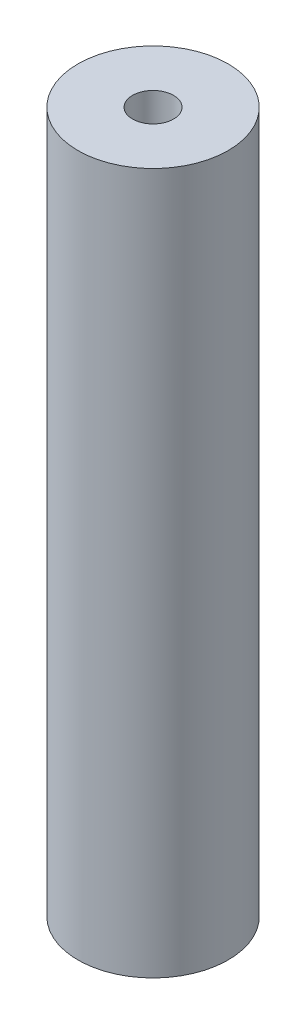
ISO-10303-21;
HEADER;
FILE_DESCRIPTION(('STEP AP214'),'2;1');
FILE_NAME('part.step','',(''),(''),'','','');
FILE_SCHEMA(('AUTOMOTIVE_DESIGN { 1 0 10303 214 1 1 1 1 }'));
ENDSEC;
DATA;
#1=APPLICATION_CONTEXT('core data for automotive mechanical design processes');
#2=APPLICATION_PROTOCOL_DEFINITION('international standard','automotive_design',2000,#1);
#3=PRODUCT_CONTEXT('',#1,'mechanical');
#4=PRODUCT('Part','Part','',(#3));
#5=PRODUCT_RELATED_PRODUCT_CATEGORY('part','',(#4));
#6=PRODUCT_DEFINITION_FORMATION('','',#4);
#7=PRODUCT_DEFINITION_CONTEXT('part definition',#1,'design');
#8=PRODUCT_DEFINITION('design','',#6,#7);
#9=PRODUCT_DEFINITION_SHAPE('','',#8);
#10=(LENGTH_UNIT() NAMED_UNIT(*) SI_UNIT(.MILLI.,.METRE.));
#11=(NAMED_UNIT(*) PLANE_ANGLE_UNIT() SI_UNIT($,.RADIAN.));
#12=(NAMED_UNIT(*) SI_UNIT($,.STERADIAN.) SOLID_ANGLE_UNIT());
#13=UNCERTAINTY_MEASURE_WITH_UNIT(LENGTH_MEASURE(1.E-05),#10,'distance_accuracy_value','');
#14=(GEOMETRIC_REPRESENTATION_CONTEXT(3) GLOBAL_UNCERTAINTY_ASSIGNED_CONTEXT((#13)) GLOBAL_UNIT_ASSIGNED_CONTEXT((#10,
#11,#12)) REPRESENTATION_CONTEXT('',''));
#15=CARTESIAN_POINT('',(0.,0.,0.));
#16=DIRECTION('',(0.,0.,1.));
#17=DIRECTION('',(1.,0.,0.));
#18=AXIS2_PLACEMENT_3D('',#15,#16,#17);
#19=CARTESIAN_POINT('',(0.,160.,0.));
#20=DIRECTION('',(0.,-1.,0.));
#21=DIRECTION('',(0.,0.,-1.));
#22=AXIS2_PLACEMENT_3D('',#19,#20,#21);
#23=CYLINDRICAL_SURFACE('',#22,7.5);
#24=CARTESIAN_POINT('',(0.,160.,0.));
#25=DIRECTION('',(0.,1.,0.));
#26=DIRECTION('',(0.,0.,1.));
#27=AXIS2_PLACEMENT_3D('',#24,#25,#26);
#28=CIRCLE('',#27,7.5);
#29=CARTESIAN_POINT('',(0.,160.,7.5));
#30=VERTEX_POINT('',#29);
#31=EDGE_CURVE('E10',#30,#30,#28,.T.);
#32=ORIENTED_EDGE('',*,*,#31,.F.);
#33=EDGE_LOOP('',(#32));
#34=FACE_BOUND('',#33,.T.);
#35=CARTESIAN_POINT('',(0.,90.,0.));
#36=DIRECTION('',(0.,-1.,0.));
#37=DIRECTION('',(0.,0.,-1.));
#38=AXIS2_PLACEMENT_3D('',#35,#36,#37);
#39=CIRCLE('',#38,7.5);
#40=CARTESIAN_POINT('',(0.,90.,-7.5));
#41=VERTEX_POINT('',#40);
#42=EDGE_CURVE('E39',#41,#41,#39,.T.);
#43=ORIENTED_EDGE('',*,*,#42,.F.);
#44=EDGE_LOOP('',(#43));
#45=FACE_BOUND('',#44,.T.);
#46=ADVANCED_FACE('F33',(#34,#45),#23,.T.);
#47=CARTESIAN_POINT('',(0.,160.,0.));
#48=DIRECTION('',(0.,1.,0.));
#49=DIRECTION('',(0.,0.,1.));
#50=AXIS2_PLACEMENT_3D('',#47,#48,#49);
#51=PLANE('',#50);
#52=ORIENTED_EDGE('',*,*,#31,.T.);
#53=EDGE_LOOP('',(#52));
#54=FACE_BOUND('',#53,.T.);
#55=CARTESIAN_POINT('',(0.,160.,0.));
#56=DIRECTION('',(0.,1.,0.));
#57=DIRECTION('',(0.,0.,1.));
#58=AXIS2_PLACEMENT_3D('',#55,#56,#57);
#59=CIRCLE('',#58,2.05);
#60=CARTESIAN_POINT('',(0.,160.,2.05));
#61=VERTEX_POINT('',#60);
#62=EDGE_CURVE('E43',#61,#61,#59,.F.);
#63=ORIENTED_EDGE('',*,*,#62,.T.);
#64=EDGE_LOOP('',(#63));
#65=FACE_BOUND('',#64,.T.);
#66=ADVANCED_FACE('F58',(#54,#65),#51,.T.);
#67=CARTESIAN_POINT('',(0.,90.,0.));
#68=DIRECTION('',(0.,-1.,0.));
#69=DIRECTION('',(0.,0.,-1.));
#70=AXIS2_PLACEMENT_3D('',#67,#68,#69);
#71=PLANE('',#70);
#72=ORIENTED_EDGE('',*,*,#42,.T.);
#73=EDGE_LOOP('',(#72));
#74=FACE_BOUND('',#73,.T.);
#75=CARTESIAN_POINT('',(0.,90.,0.));
#76=DIRECTION('',(0.,-1.,0.));
#77=DIRECTION('',(0.,0.,-1.));
#78=AXIS2_PLACEMENT_3D('',#75,#76,#77);
#79=CIRCLE('',#78,2.05);
#80=CARTESIAN_POINT('',(0.,90.,-2.05));
#81=VERTEX_POINT('',#80);
#82=EDGE_CURVE('E47',#81,#81,#79,.T.);
#83=ORIENTED_EDGE('',*,*,#82,.F.);
#84=EDGE_LOOP('',(#83));
#85=FACE_BOUND('',#84,.T.);
#86=ADVANCED_FACE('F56',(#74,#85),#71,.T.);
#87=CARTESIAN_POINT('',(0.,173.121890351803,0.));
#88=DIRECTION('',(0.,-1.,0.));
#89=DIRECTION('',(0.,0.,-1.));
#90=AXIS2_PLACEMENT_3D('',#87,#88,#89);
#91=CYLINDRICAL_SURFACE('',#90,2.05);
#92=ORIENTED_EDGE('',*,*,#82,.T.);
#93=EDGE_LOOP('',(#92));
#94=FACE_BOUND('',#93,.T.);
#95=ORIENTED_EDGE('',*,*,#62,.F.);
#96=EDGE_LOOP('',(#95));
#97=FACE_BOUND('',#96,.T.);
#98=ADVANCED_FACE('F53',(#94,#97),#91,.F.);
#99=CLOSED_SHELL('',(#46,#66,#86,#98));
#100=MANIFOLD_SOLID_BREP('B2',#99);
#101=ADVANCED_BREP_SHAPE_REPRESENTATION('',(#18,#100),#14);
#102=SHAPE_DEFINITION_REPRESENTATION(#9,#101);
ENDSEC;
END-ISO-10303-21;
